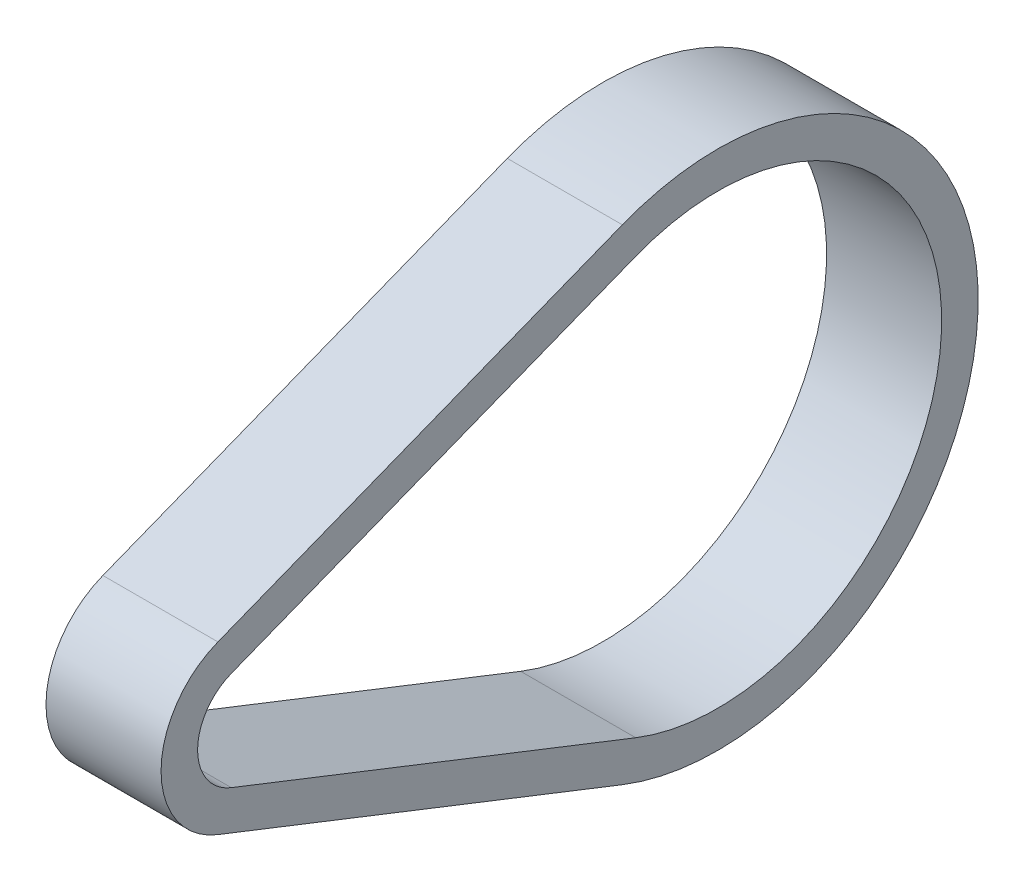
ISO-10303-21;
HEADER;
FILE_DESCRIPTION(('STEP AP214'),'2;1');
FILE_NAME('part.step','',(''),(''),'','','');
FILE_SCHEMA(('AUTOMOTIVE_DESIGN { 1 0 10303 214 1 1 1 1 }'));
ENDSEC;
DATA;
#1=APPLICATION_CONTEXT('core data for automotive mechanical design processes');
#2=APPLICATION_PROTOCOL_DEFINITION('international standard','automotive_design',2000,#1);
#3=PRODUCT_CONTEXT('',#1,'mechanical');
#4=PRODUCT('Part','Part','',(#3));
#5=PRODUCT_RELATED_PRODUCT_CATEGORY('part','',(#4));
#6=PRODUCT_DEFINITION_FORMATION('','',#4);
#7=PRODUCT_DEFINITION_CONTEXT('part definition',#1,'design');
#8=PRODUCT_DEFINITION('design','',#6,#7);
#9=PRODUCT_DEFINITION_SHAPE('','',#8);
#10=(LENGTH_UNIT() NAMED_UNIT(*) SI_UNIT(.MILLI.,.METRE.));
#11=(NAMED_UNIT(*) PLANE_ANGLE_UNIT() SI_UNIT($,.RADIAN.));
#12=(NAMED_UNIT(*) SI_UNIT($,.STERADIAN.) SOLID_ANGLE_UNIT());
#13=UNCERTAINTY_MEASURE_WITH_UNIT(LENGTH_MEASURE(1.E-05),#10,'distance_accuracy_value','');
#14=(GEOMETRIC_REPRESENTATION_CONTEXT(3) GLOBAL_UNCERTAINTY_ASSIGNED_CONTEXT((#13)) GLOBAL_UNIT_ASSIGNED_CONTEXT((#10,
#11,#12)) REPRESENTATION_CONTEXT('',''));
#15=CARTESIAN_POINT('',(0.,0.,0.));
#16=DIRECTION('',(0.,0.,1.));
#17=DIRECTION('',(1.,0.,0.));
#18=AXIS2_PLACEMENT_3D('',#15,#16,#17);
#19=CARTESIAN_POINT('',(7.5,0.,0.));
#20=DIRECTION('',(1.,0.,0.));
#21=DIRECTION('',(0.,0.,-1.));
#22=AXIS2_PLACEMENT_3D('',#19,#20,#21);
#23=PLANE('',#22);
#24=CARTESIAN_POINT('',(7.5,0.,0.));
#25=DIRECTION('',(1.,0.,0.));
#26=DIRECTION('',(0.,0.,-1.));
#27=AXIS2_PLACEMENT_3D('',#24,#25,#26);
#28=CIRCLE('',#27,11.68908);
#29=CARTESIAN_POINT('',(7.5,10.8785216485568,4.27695662688809));
#30=VERTEX_POINT('',#29);
#31=CARTESIAN_POINT('',(7.5,-10.8785216485568,4.27695662688809));
#32=VERTEX_POINT('',#31);
#33=EDGE_CURVE('E136',#30,#32,#28,.T.);
#34=ORIENTED_EDGE('',*,*,#33,.T.);
#35=DIRECTION('',(0.,-0.365893348910957,-0.930656788092541));
#36=VECTOR('',#35,1.);
#37=CARTESIAN_POINT('',(7.5,-10.8785216485568,4.27695662688809));
#38=LINE('',#37,#36);
#39=CARTESIAN_POINT('',(7.5,-31.6072822605068,-48.4470456805474));
#40=VERTEX_POINT('',#39);
#41=EDGE_CURVE('E139',#32,#40,#38,.T.);
#42=ORIENTED_EDGE('',*,*,#41,.T.);
#43=CARTESIAN_POINT('',(7.5,0.,-60.87364));
#44=DIRECTION('',(1.,0.,0.));
#45=DIRECTION('',(0.,0.,-1.));
#46=AXIS2_PLACEMENT_3D('',#43,#44,#45);
#47=CIRCLE('',#46,33.96234);
#48=CARTESIAN_POINT('',(7.5,31.6072822605068,-48.4470456805474));
#49=VERTEX_POINT('',#48);
#50=EDGE_CURVE('E142',#40,#49,#47,.T.);
#51=ORIENTED_EDGE('',*,*,#50,.T.);
#52=DIRECTION('',(0.,-0.365893348910957,0.930656788092541));
#53=VECTOR('',#52,1.);
#54=CARTESIAN_POINT('',(7.5,10.8785216485568,4.27695662688809));
#55=LINE('',#54,#53);
#56=EDGE_CURVE('E144',#49,#30,#55,.T.);
#57=ORIENTED_EDGE('',*,*,#56,.T.);
#58=EDGE_LOOP('',(#34,#42,#51,#57));
#59=FACE_BOUND('',#58,.T.);
#60=DIRECTION('',(0.,-0.365893348910957,-0.930656788092541));
#61=VECTOR('',#60,1.);
#62=CARTESIAN_POINT('',(7.5,-6.44626869526603,2.53438955269966));
#63=LINE('',#62,#61);
#64=CARTESIAN_POINT('',(7.5,-6.44626869526603,2.53438955269966));
#65=VERTEX_POINT('',#64);
#66=CARTESIAN_POINT('',(7.5,-27.1750293072161,-50.1896127547359));
#67=VERTEX_POINT('',#66);
#68=EDGE_CURVE('E108',#65,#67,#63,.T.);
#69=ORIENTED_EDGE('',*,*,#68,.F.);
#70=CARTESIAN_POINT('',(7.5,0.,0.));
#71=DIRECTION('',(1.,0.,0.));
#72=DIRECTION('',(0.,0.,-1.));
#73=AXIS2_PLACEMENT_3D('',#70,#71,#72);
#74=CIRCLE('',#73,6.92658);
#75=CARTESIAN_POINT('',(7.5,6.44626869526603,2.53438955269966));
#76=VERTEX_POINT('',#75);
#77=EDGE_CURVE('E100',#76,#65,#74,.T.);
#78=ORIENTED_EDGE('',*,*,#77,.F.);
#79=DIRECTION('',(0.,-0.365893348910957,0.930656788092541));
#80=VECTOR('',#79,1.);
#81=CARTESIAN_POINT('',(7.5,6.44626869526603,2.53438955269966));
#82=LINE('',#81,#80);
#83=CARTESIAN_POINT('',(7.5,27.1750293072161,-50.1896127547359));
#84=VERTEX_POINT('',#83);
#85=EDGE_CURVE('E122',#84,#76,#82,.T.);
#86=ORIENTED_EDGE('',*,*,#85,.F.);
#87=CARTESIAN_POINT('',(7.5,0.,-60.87364));
#88=DIRECTION('',(1.,0.,0.));
#89=DIRECTION('',(0.,0.,-1.));
#90=AXIS2_PLACEMENT_3D('',#87,#88,#89);
#91=CIRCLE('',#90,29.19984);
#92=EDGE_CURVE('E120',#67,#84,#91,.T.);
#93=ORIENTED_EDGE('',*,*,#92,.F.);
#94=EDGE_LOOP('',(#69,#78,#86,#93));
#95=FACE_BOUND('',#94,.T.);
#96=ADVANCED_FACE('F35',(#59,#95),#23,.T.);
#97=CARTESIAN_POINT('',(-7.5,0.,0.));
#98=DIRECTION('',(1.,0.,0.));
#99=DIRECTION('',(0.,0.,-1.));
#100=AXIS2_PLACEMENT_3D('',#97,#98,#99);
#101=PLANE('',#100);
#102=CARTESIAN_POINT('',(-7.5,0.,0.));
#103=DIRECTION('',(1.,0.,0.));
#104=DIRECTION('',(0.,0.,-1.));
#105=AXIS2_PLACEMENT_3D('',#102,#103,#104);
#106=CIRCLE('',#105,11.68908);
#107=CARTESIAN_POINT('',(-7.5,10.8785216485568,4.27695662688809));
#108=VERTEX_POINT('',#107);
#109=CARTESIAN_POINT('',(-7.5,-10.8785216485568,4.27695662688809));
#110=VERTEX_POINT('',#109);
#111=EDGE_CURVE('E116',#108,#110,#106,.T.);
#112=ORIENTED_EDGE('',*,*,#111,.F.);
#113=DIRECTION('',(0.,-0.365893348910957,0.930656788092541));
#114=VECTOR('',#113,1.);
#115=CARTESIAN_POINT('',(-7.5,10.8785216485568,4.27695662688809));
#116=LINE('',#115,#114);
#117=CARTESIAN_POINT('',(-7.5,31.6072822605068,-48.4470456805474));
#118=VERTEX_POINT('',#117);
#119=EDGE_CURVE('E140',#118,#108,#116,.T.);
#120=ORIENTED_EDGE('',*,*,#119,.F.);
#121=CARTESIAN_POINT('',(-7.5,0.,-60.87364));
#122=DIRECTION('',(1.,0.,0.));
#123=DIRECTION('',(0.,0.,-1.));
#124=AXIS2_PLACEMENT_3D('',#121,#122,#123);
#125=CIRCLE('',#124,33.96234);
#126=CARTESIAN_POINT('',(-7.5,-31.6072822605068,-48.4470456805474));
#127=VERTEX_POINT('',#126);
#128=EDGE_CURVE('E151',#127,#118,#125,.T.);
#129=ORIENTED_EDGE('',*,*,#128,.F.);
#130=DIRECTION('',(0.,-0.365893348910957,-0.930656788092541));
#131=VECTOR('',#130,1.);
#132=CARTESIAN_POINT('',(-7.5,-10.8785216485568,4.27695662688809));
#133=LINE('',#132,#131);
#134=EDGE_CURVE('E149',#110,#127,#133,.T.);
#135=ORIENTED_EDGE('',*,*,#134,.F.);
#136=EDGE_LOOP('',(#112,#120,#129,#135));
#137=FACE_BOUND('',#136,.T.);
#138=CARTESIAN_POINT('',(-7.5,0.,0.));
#139=DIRECTION('',(1.,0.,0.));
#140=DIRECTION('',(0.,0.,-1.));
#141=AXIS2_PLACEMENT_3D('',#138,#139,#140);
#142=CIRCLE('',#141,6.92658);
#143=CARTESIAN_POINT('',(-7.5,6.44626869526603,2.53438955269966));
#144=VERTEX_POINT('',#143);
#145=CARTESIAN_POINT('',(-7.5,-6.44626869526603,2.53438955269966));
#146=VERTEX_POINT('',#145);
#147=EDGE_CURVE('E58',#144,#146,#142,.T.);
#148=ORIENTED_EDGE('',*,*,#147,.T.);
#149=DIRECTION('',(0.,-0.365893348910957,-0.930656788092541));
#150=VECTOR('',#149,1.);
#151=CARTESIAN_POINT('',(-7.5,-6.44626869526603,2.53438955269966));
#152=LINE('',#151,#150);
#153=CARTESIAN_POINT('',(-7.5,-27.1750293072161,-50.1896127547359));
#154=VERTEX_POINT('',#153);
#155=EDGE_CURVE('E115',#146,#154,#152,.T.);
#156=ORIENTED_EDGE('',*,*,#155,.T.);
#157=CARTESIAN_POINT('',(-7.5,0.,-60.87364));
#158=DIRECTION('',(1.,0.,0.));
#159=DIRECTION('',(0.,0.,-1.));
#160=AXIS2_PLACEMENT_3D('',#157,#158,#159);
#161=CIRCLE('',#160,29.19984);
#162=CARTESIAN_POINT('',(-7.5,27.1750293072161,-50.1896127547359));
#163=VERTEX_POINT('',#162);
#164=EDGE_CURVE('E128',#154,#163,#161,.T.);
#165=ORIENTED_EDGE('',*,*,#164,.T.);
#166=DIRECTION('',(0.,-0.365893348910957,0.930656788092541));
#167=VECTOR('',#166,1.);
#168=CARTESIAN_POINT('',(-7.5,6.44626869526603,2.53438955269966));
#169=LINE('',#168,#167);
#170=EDGE_CURVE('E109',#163,#144,#169,.T.);
#171=ORIENTED_EDGE('',*,*,#170,.T.);
#172=EDGE_LOOP('',(#148,#156,#165,#171));
#173=FACE_BOUND('',#172,.T.);
#174=ADVANCED_FACE('F169',(#137,#173),#101,.F.);
#175=CARTESIAN_POINT('',(7.5,0.,0.));
#176=DIRECTION('',(-1.,0.,0.));
#177=DIRECTION('',(0.,0.,1.));
#178=AXIS2_PLACEMENT_3D('',#175,#176,#177);
#179=CYLINDRICAL_SURFACE('',#178,11.68908);
#180=ORIENTED_EDGE('',*,*,#111,.T.);
#181=DIRECTION('',(-1.,0.,0.));
#182=VECTOR('',#181,1.);
#183=CARTESIAN_POINT('',(7.5,-10.8785216485568,4.27695662688809));
#184=LINE('',#183,#182);
#185=EDGE_CURVE('E11',#32,#110,#184,.T.);
#186=ORIENTED_EDGE('',*,*,#185,.F.);
#187=ORIENTED_EDGE('',*,*,#33,.F.);
#188=DIRECTION('',(-1.,0.,0.));
#189=VECTOR('',#188,1.);
#190=CARTESIAN_POINT('',(7.5,10.8785216485568,4.27695662688809));
#191=LINE('',#190,#189);
#192=EDGE_CURVE('E146',#30,#108,#191,.T.);
#193=ORIENTED_EDGE('',*,*,#192,.T.);
#194=EDGE_LOOP('',(#180,#186,#187,#193));
#195=FACE_BOUND('',#194,.T.);
#196=ADVANCED_FACE('F37',(#195),#179,.T.);
#197=CARTESIAN_POINT('',(7.5,-10.8785216485568,4.27695662688809));
#198=DIRECTION('',(0.,0.930656788092541,-0.365893348910957));
#199=DIRECTION('',(0.,0.365893348910957,0.930656788092541));
#200=AXIS2_PLACEMENT_3D('',#197,#198,#199);
#201=PLANE('',#200);
#202=ORIENTED_EDGE('',*,*,#134,.T.);
#203=DIRECTION('',(-1.,0.,0.));
#204=VECTOR('',#203,1.);
#205=CARTESIAN_POINT('',(7.5,-31.6072822605068,-48.4470456805474));
#206=LINE('',#205,#204);
#207=EDGE_CURVE('E43',#40,#127,#206,.T.);
#208=ORIENTED_EDGE('',*,*,#207,.F.);
#209=ORIENTED_EDGE('',*,*,#41,.F.);
#210=ORIENTED_EDGE('',*,*,#185,.T.);
#211=EDGE_LOOP('',(#202,#208,#209,#210));
#212=FACE_BOUND('',#211,.T.);
#213=ADVANCED_FACE('F179',(#212),#201,.F.);
#214=CARTESIAN_POINT('',(7.5,0.,-60.87364));
#215=DIRECTION('',(-1.,0.,0.));
#216=DIRECTION('',(0.,0.,1.));
#217=AXIS2_PLACEMENT_3D('',#214,#215,#216);
#218=CYLINDRICAL_SURFACE('',#217,33.96234);
#219=ORIENTED_EDGE('',*,*,#128,.T.);
#220=DIRECTION('',(-1.,0.,0.));
#221=VECTOR('',#220,1.);
#222=CARTESIAN_POINT('',(7.5,31.6072822605068,-48.4470456805474));
#223=LINE('',#222,#221);
#224=EDGE_CURVE('E156',#49,#118,#223,.T.);
#225=ORIENTED_EDGE('',*,*,#224,.F.);
#226=ORIENTED_EDGE('',*,*,#50,.F.);
#227=ORIENTED_EDGE('',*,*,#207,.T.);
#228=EDGE_LOOP('',(#219,#225,#226,#227));
#229=FACE_BOUND('',#228,.T.);
#230=ADVANCED_FACE('F163',(#229),#218,.T.);
#231=CARTESIAN_POINT('',(7.5,10.8785216485568,4.27695662688809));
#232=DIRECTION('',(0.,-0.930656788092541,-0.365893348910957));
#233=DIRECTION('',(0.,0.365893348910957,-0.930656788092541));
#234=AXIS2_PLACEMENT_3D('',#231,#232,#233);
#235=PLANE('',#234);
#236=ORIENTED_EDGE('',*,*,#119,.T.);
#237=ORIENTED_EDGE('',*,*,#192,.F.);
#238=ORIENTED_EDGE('',*,*,#56,.F.);
#239=ORIENTED_EDGE('',*,*,#224,.T.);
#240=EDGE_LOOP('',(#236,#237,#238,#239));
#241=FACE_BOUND('',#240,.T.);
#242=ADVANCED_FACE('F173',(#241),#235,.F.);
#243=CARTESIAN_POINT('',(7.5,0.,0.));
#244=DIRECTION('',(-1.,0.,0.));
#245=DIRECTION('',(0.,0.,1.));
#246=AXIS2_PLACEMENT_3D('',#243,#244,#245);
#247=CYLINDRICAL_SURFACE('',#246,6.92658);
#248=ORIENTED_EDGE('',*,*,#147,.F.);
#249=DIRECTION('',(-1.,0.,0.));
#250=VECTOR('',#249,1.);
#251=CARTESIAN_POINT('',(7.5,6.44626869526603,2.53438955269966));
#252=LINE('',#251,#250);
#253=EDGE_CURVE('E104',#76,#144,#252,.T.);
#254=ORIENTED_EDGE('',*,*,#253,.F.);
#255=ORIENTED_EDGE('',*,*,#77,.T.);
#256=DIRECTION('',(-1.,0.,0.));
#257=VECTOR('',#256,1.);
#258=CARTESIAN_POINT('',(7.5,-6.44626869526603,2.53438955269966));
#259=LINE('',#258,#257);
#260=EDGE_CURVE('E103',#65,#146,#259,.T.);
#261=ORIENTED_EDGE('',*,*,#260,.T.);
#262=EDGE_LOOP('',(#248,#254,#255,#261));
#263=FACE_BOUND('',#262,.T.);
#264=ADVANCED_FACE('F102',(#263),#247,.F.);
#265=CARTESIAN_POINT('',(7.5,-6.44626869526603,2.53438955269966));
#266=DIRECTION('',(0.,0.930656788092541,-0.365893348910957));
#267=DIRECTION('',(0.,0.365893348910957,0.930656788092541));
#268=AXIS2_PLACEMENT_3D('',#265,#266,#267);
#269=PLANE('',#268);
#270=ORIENTED_EDGE('',*,*,#155,.F.);
#271=ORIENTED_EDGE('',*,*,#260,.F.);
#272=ORIENTED_EDGE('',*,*,#68,.T.);
#273=DIRECTION('',(-1.,0.,0.));
#274=VECTOR('',#273,1.);
#275=CARTESIAN_POINT('',(7.5,-27.1750293072161,-50.1896127547359));
#276=LINE('',#275,#274);
#277=EDGE_CURVE('E117',#67,#154,#276,.T.);
#278=ORIENTED_EDGE('',*,*,#277,.T.);
#279=EDGE_LOOP('',(#270,#271,#272,#278));
#280=FACE_BOUND('',#279,.T.);
#281=ADVANCED_FACE('F112',(#280),#269,.T.);
#282=CARTESIAN_POINT('',(7.5,0.,-60.87364));
#283=DIRECTION('',(-1.,0.,0.));
#284=DIRECTION('',(0.,0.,1.));
#285=AXIS2_PLACEMENT_3D('',#282,#283,#284);
#286=CYLINDRICAL_SURFACE('',#285,29.19984);
#287=ORIENTED_EDGE('',*,*,#164,.F.);
#288=ORIENTED_EDGE('',*,*,#277,.F.);
#289=ORIENTED_EDGE('',*,*,#92,.T.);
#290=DIRECTION('',(-1.,0.,0.));
#291=VECTOR('',#290,1.);
#292=CARTESIAN_POINT('',(7.5,27.1750293072161,-50.1896127547359));
#293=LINE('',#292,#291);
#294=EDGE_CURVE('E50',#84,#163,#293,.T.);
#295=ORIENTED_EDGE('',*,*,#294,.T.);
#296=EDGE_LOOP('',(#287,#288,#289,#295));
#297=FACE_BOUND('',#296,.T.);
#298=ADVANCED_FACE('F202',(#297),#286,.F.);
#299=CARTESIAN_POINT('',(7.5,6.44626869526603,2.53438955269966));
#300=DIRECTION('',(0.,-0.930656788092541,-0.365893348910957));
#301=DIRECTION('',(0.,0.365893348910957,-0.930656788092541));
#302=AXIS2_PLACEMENT_3D('',#299,#300,#301);
#303=PLANE('',#302);
#304=ORIENTED_EDGE('',*,*,#170,.F.);
#305=ORIENTED_EDGE('',*,*,#294,.F.);
#306=ORIENTED_EDGE('',*,*,#85,.T.);
#307=ORIENTED_EDGE('',*,*,#253,.T.);
#308=EDGE_LOOP('',(#304,#305,#306,#307));
#309=FACE_BOUND('',#308,.T.);
#310=ADVANCED_FACE('F206',(#309),#303,.T.);
#311=CLOSED_SHELL('',(#96,#174,#196,#213,#230,#242,#264,#281,#298,#310));
#312=MANIFOLD_SOLID_BREP('B2',#311);
#313=ADVANCED_BREP_SHAPE_REPRESENTATION('',(#18,#312),#14);
#314=SHAPE_DEFINITION_REPRESENTATION(#9,#313);
ENDSEC;
END-ISO-10303-21;
